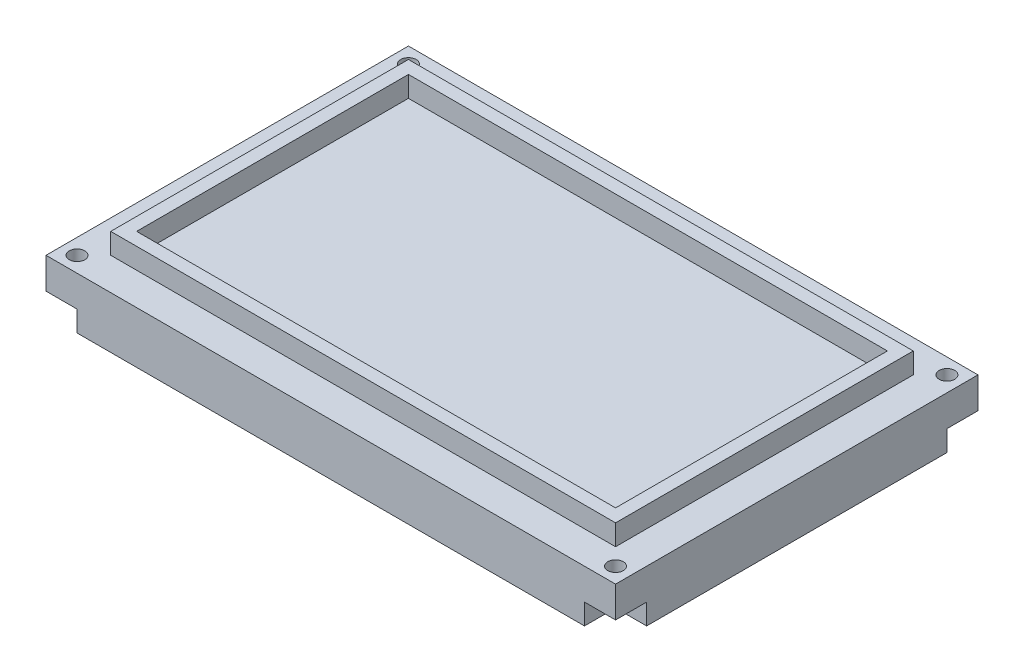
ISO-10303-21;
HEADER;
FILE_DESCRIPTION(('STEP AP214'),'2;1');
FILE_NAME('part.step','',(''),(''),'','','');
FILE_SCHEMA(('AUTOMOTIVE_DESIGN { 1 0 10303 214 1 1 1 1 }'));
ENDSEC;
DATA;
#1=APPLICATION_CONTEXT('core data for automotive mechanical design processes');
#2=APPLICATION_PROTOCOL_DEFINITION('international standard','automotive_design',2000,#1);
#3=PRODUCT_CONTEXT('',#1,'mechanical');
#4=PRODUCT('Part','Part','',(#3));
#5=PRODUCT_RELATED_PRODUCT_CATEGORY('part','',(#4));
#6=PRODUCT_DEFINITION_FORMATION('','',#4);
#7=PRODUCT_DEFINITION_CONTEXT('part definition',#1,'design');
#8=PRODUCT_DEFINITION('design','',#6,#7);
#9=PRODUCT_DEFINITION_SHAPE('','',#8);
#10=(LENGTH_UNIT() NAMED_UNIT(*) SI_UNIT(.MILLI.,.METRE.));
#11=(NAMED_UNIT(*) PLANE_ANGLE_UNIT() SI_UNIT($,.RADIAN.));
#12=(NAMED_UNIT(*) SI_UNIT($,.STERADIAN.) SOLID_ANGLE_UNIT());
#13=UNCERTAINTY_MEASURE_WITH_UNIT(LENGTH_MEASURE(1.E-05),#10,'distance_accuracy_value','');
#14=(GEOMETRIC_REPRESENTATION_CONTEXT(3) GLOBAL_UNCERTAINTY_ASSIGNED_CONTEXT((#13)) GLOBAL_UNIT_ASSIGNED_CONTEXT((#10,
#11,#12)) REPRESENTATION_CONTEXT('',''));
#15=CARTESIAN_POINT('',(0.,0.,0.));
#16=DIRECTION('',(0.,0.,1.));
#17=DIRECTION('',(1.,0.,0.));
#18=AXIS2_PLACEMENT_3D('',#15,#16,#17);
#19=CARTESIAN_POINT('',(0.,0.,0.));
#20=DIRECTION('',(0.,1.,0.));
#21=DIRECTION('',(0.,0.,1.));
#22=AXIS2_PLACEMENT_3D('',#19,#20,#21);
#23=PLANE('',#22);
#24=DIRECTION('',(1.,0.,0.));
#25=VECTOR('',#24,1.);
#26=CARTESIAN_POINT('',(-69.85,0.,-36.83));
#27=LINE('',#26,#25);
#28=CARTESIAN_POINT('',(-69.85,0.,-36.83));
#29=VERTEX_POINT('',#28);
#30=CARTESIAN_POINT('',(-62.2299999999999,0.,-36.83));
#31=VERTEX_POINT('',#30);
#32=EDGE_CURVE('E215',#29,#31,#27,.T.);
#33=ORIENTED_EDGE('',*,*,#32,.T.);
#34=DIRECTION('',(0.,0.,-1.));
#35=VECTOR('',#34,1.);
#36=CARTESIAN_POINT('',(-62.2299999999999,0.,-36.83));
#37=LINE('',#36,#35);
#38=CARTESIAN_POINT('',(-62.2299999999999,0.,-44.45));
#39=VERTEX_POINT('',#38);
#40=EDGE_CURVE('E508',#31,#39,#37,.T.);
#41=ORIENTED_EDGE('',*,*,#40,.T.);
#42=DIRECTION('',(-1.,0.,0.));
#43=VECTOR('',#42,1.);
#44=CARTESIAN_POINT('',(-69.85,0.,-44.45));
#45=LINE('',#44,#43);
#46=CARTESIAN_POINT('',(62.2299999999999,0.,-44.45));
#47=VERTEX_POINT('',#46);
#48=EDGE_CURVE('E447',#47,#39,#45,.T.);
#49=ORIENTED_EDGE('',*,*,#48,.F.);
#50=DIRECTION('',(0.,0.,-1.));
#51=VECTOR('',#50,1.);
#52=CARTESIAN_POINT('',(62.2299999999999,0.,-36.83));
#53=LINE('',#52,#51);
#54=CARTESIAN_POINT('',(62.2299999999999,0.,-36.83));
#55=VERTEX_POINT('',#54);
#56=EDGE_CURVE('E270',#55,#47,#53,.T.);
#57=ORIENTED_EDGE('',*,*,#56,.F.);
#58=DIRECTION('',(-1.,0.,0.));
#59=VECTOR('',#58,1.);
#60=CARTESIAN_POINT('',(69.85,0.,-36.83));
#61=LINE('',#60,#59);
#62=CARTESIAN_POINT('',(69.85,0.,-36.83));
#63=VERTEX_POINT('',#62);
#64=EDGE_CURVE('E481',#63,#55,#61,.T.);
#65=ORIENTED_EDGE('',*,*,#64,.F.);
#66=DIRECTION('',(0.,0.,-1.));
#67=VECTOR('',#66,1.);
#68=CARTESIAN_POINT('',(69.85,0.,-44.45));
#69=LINE('',#68,#67);
#70=CARTESIAN_POINT('',(69.85,0.,36.83));
#71=VERTEX_POINT('',#70);
#72=EDGE_CURVE('E430',#71,#63,#69,.T.);
#73=ORIENTED_EDGE('',*,*,#72,.F.);
#74=DIRECTION('',(-1.,0.,0.));
#75=VECTOR('',#74,1.);
#76=CARTESIAN_POINT('',(69.85,0.,36.83));
#77=LINE('',#76,#75);
#78=CARTESIAN_POINT('',(62.2299999999999,0.,36.83));
#79=VERTEX_POINT('',#78);
#80=EDGE_CURVE('E259',#71,#79,#77,.T.);
#81=ORIENTED_EDGE('',*,*,#80,.T.);
#82=DIRECTION('',(0.,0.,1.));
#83=VECTOR('',#82,1.);
#84=CARTESIAN_POINT('',(62.2299999999999,0.,36.83));
#85=LINE('',#84,#83);
#86=CARTESIAN_POINT('',(62.2299999999999,0.,44.45));
#87=VERTEX_POINT('',#86);
#88=EDGE_CURVE('E252',#79,#87,#85,.T.);
#89=ORIENTED_EDGE('',*,*,#88,.T.);
#90=DIRECTION('',(1.,0.,0.));
#91=VECTOR('',#90,1.);
#92=CARTESIAN_POINT('',(-69.8499999999999,0.,44.45));
#93=LINE('',#92,#91);
#94=CARTESIAN_POINT('',(-62.2299999999999,0.,44.45));
#95=VERTEX_POINT('',#94);
#96=EDGE_CURVE('E436',#95,#87,#93,.T.);
#97=ORIENTED_EDGE('',*,*,#96,.F.);
#98=DIRECTION('',(0.,0.,1.));
#99=VECTOR('',#98,1.);
#100=CARTESIAN_POINT('',(-62.2299999999999,0.,36.83));
#101=LINE('',#100,#99);
#102=CARTESIAN_POINT('',(-62.2299999999999,0.,36.83));
#103=VERTEX_POINT('',#102);
#104=EDGE_CURVE('E307',#103,#95,#101,.T.);
#105=ORIENTED_EDGE('',*,*,#104,.F.);
#106=DIRECTION('',(1.,0.,0.));
#107=VECTOR('',#106,1.);
#108=CARTESIAN_POINT('',(-69.85,0.,36.83));
#109=LINE('',#108,#107);
#110=CARTESIAN_POINT('',(-69.8499999999999,0.,36.83));
#111=VERTEX_POINT('',#110);
#112=EDGE_CURVE('E247',#111,#103,#109,.T.);
#113=ORIENTED_EDGE('',*,*,#112,.F.);
#114=DIRECTION('',(0.,0.,1.));
#115=VECTOR('',#114,1.);
#116=CARTESIAN_POINT('',(-69.85,0.,-44.45));
#117=LINE('',#116,#115);
#118=EDGE_CURVE('E450',#29,#111,#117,.T.);
#119=ORIENTED_EDGE('',*,*,#118,.F.);
#120=EDGE_LOOP('',(#33,#41,#49,#57,#65,#73,#81,#89,#97,#105,#113,#119));
#121=FACE_BOUND('',#120,.T.);
#122=ADVANCED_FACE('F39',(#121),#23,.F.);
#123=CARTESIAN_POINT('',(-69.85,12.7,-44.45));
#124=DIRECTION('',(0.,0.,1.));
#125=DIRECTION('',(1.,0.,0.));
#126=AXIS2_PLACEMENT_3D('',#123,#124,#125);
#127=PLANE('',#126);
#128=DIRECTION('',(0.,-1.,0.));
#129=VECTOR('',#128,1.);
#130=CARTESIAN_POINT('',(-62.2299999999999,5.08,-44.45));
#131=LINE('',#130,#129);
#132=CARTESIAN_POINT('',(-62.2299999999999,5.08,-44.45));
#133=VERTEX_POINT('',#132);
#134=EDGE_CURVE('E222',#133,#39,#131,.T.);
#135=ORIENTED_EDGE('',*,*,#134,.F.);
#136=DIRECTION('',(-1.,0.,0.));
#137=VECTOR('',#136,1.);
#138=CARTESIAN_POINT('',(-62.2299999999999,5.08,-44.45));
#139=LINE('',#138,#137);
#140=CARTESIAN_POINT('',(-69.8499999999999,5.08,-44.45));
#141=VERTEX_POINT('',#140);
#142=EDGE_CURVE('E209',#133,#141,#139,.T.);
#143=ORIENTED_EDGE('',*,*,#142,.T.);
#144=DIRECTION('',(0.,-1.,0.));
#145=VECTOR('',#144,1.);
#146=CARTESIAN_POINT('',(-69.85,12.7,-44.45));
#147=LINE('',#146,#145);
#148=CARTESIAN_POINT('',(-69.85,12.7,-44.45));
#149=VERTEX_POINT('',#148);
#150=EDGE_CURVE('E49',#149,#141,#147,.T.);
#151=ORIENTED_EDGE('',*,*,#150,.F.);
#152=DIRECTION('',(-1.,0.,0.));
#153=VECTOR('',#152,1.);
#154=CARTESIAN_POINT('',(-69.85,12.7,-44.45));
#155=LINE('',#154,#153);
#156=CARTESIAN_POINT('',(69.85,12.7,-44.45));
#157=VERTEX_POINT('',#156);
#158=EDGE_CURVE('E435',#157,#149,#155,.T.);
#159=ORIENTED_EDGE('',*,*,#158,.F.);
#160=DIRECTION('',(0.,-1.,0.));
#161=VECTOR('',#160,1.);
#162=CARTESIAN_POINT('',(69.85,12.7,-44.45));
#163=LINE('',#162,#161);
#164=CARTESIAN_POINT('',(69.8499999999999,5.08,-44.45));
#165=VERTEX_POINT('',#164);
#166=EDGE_CURVE('E11',#157,#165,#163,.T.);
#167=ORIENTED_EDGE('',*,*,#166,.T.);
#168=DIRECTION('',(1.,0.,0.));
#169=VECTOR('',#168,1.);
#170=CARTESIAN_POINT('',(62.2299999999999,5.08,-44.45));
#171=LINE('',#170,#169);
#172=CARTESIAN_POINT('',(62.2299999999999,5.08,-44.45));
#173=VERTEX_POINT('',#172);
#174=EDGE_CURVE('E275',#173,#165,#171,.T.);
#175=ORIENTED_EDGE('',*,*,#174,.F.);
#176=DIRECTION('',(0.,-1.,0.));
#177=VECTOR('',#176,1.);
#178=CARTESIAN_POINT('',(62.2299999999999,5.08,-44.45));
#179=LINE('',#178,#177);
#180=EDGE_CURVE('E253',#173,#47,#179,.T.);
#181=ORIENTED_EDGE('',*,*,#180,.T.);
#182=ORIENTED_EDGE('',*,*,#48,.T.);
#183=EDGE_LOOP('',(#135,#143,#151,#159,#167,#175,#181,#182));
#184=FACE_BOUND('',#183,.T.);
#185=ADVANCED_FACE('F219',(#184),#127,.F.);
#186=CARTESIAN_POINT('',(-69.85,12.7,-44.45));
#187=DIRECTION('',(1.,0.,0.));
#188=DIRECTION('',(0.,0.,-1.));
#189=AXIS2_PLACEMENT_3D('',#186,#187,#188);
#190=PLANE('',#189);
#191=DIRECTION('',(0.,-1.,0.));
#192=VECTOR('',#191,1.);
#193=CARTESIAN_POINT('',(-69.85,5.08,-36.83));
#194=LINE('',#193,#192);
#195=CARTESIAN_POINT('',(-69.85,5.08,-36.83));
#196=VERTEX_POINT('',#195);
#197=EDGE_CURVE('E57',#196,#29,#194,.T.);
#198=ORIENTED_EDGE('',*,*,#197,.T.);
#199=ORIENTED_EDGE('',*,*,#118,.T.);
#200=DIRECTION('',(0.,-1.,0.));
#201=VECTOR('',#200,1.);
#202=CARTESIAN_POINT('',(-69.85,5.08,36.83));
#203=LINE('',#202,#201);
#204=CARTESIAN_POINT('',(-69.85,5.08,36.83));
#205=VERTEX_POINT('',#204);
#206=EDGE_CURVE('E318',#205,#111,#203,.T.);
#207=ORIENTED_EDGE('',*,*,#206,.F.);
#208=DIRECTION('',(0.,0.,-1.));
#209=VECTOR('',#208,1.);
#210=CARTESIAN_POINT('',(-69.8499999999999,5.08,44.45));
#211=LINE('',#210,#209);
#212=CARTESIAN_POINT('',(-69.8499999999999,5.08,44.45));
#213=VERTEX_POINT('',#212);
#214=EDGE_CURVE('E302',#213,#205,#211,.T.);
#215=ORIENTED_EDGE('',*,*,#214,.F.);
#216=DIRECTION('',(0.,-1.,0.));
#217=VECTOR('',#216,1.);
#218=CARTESIAN_POINT('',(-69.8499999999999,12.7,44.45));
#219=LINE('',#218,#217);
#220=CARTESIAN_POINT('',(-69.8499999999999,12.7,44.45));
#221=VERTEX_POINT('',#220);
#222=EDGE_CURVE('E230',#221,#213,#219,.T.);
#223=ORIENTED_EDGE('',*,*,#222,.F.);
#224=DIRECTION('',(0.,0.,1.));
#225=VECTOR('',#224,1.);
#226=CARTESIAN_POINT('',(-69.85,12.7,-44.45));
#227=LINE('',#226,#225);
#228=EDGE_CURVE('E228',#149,#221,#227,.T.);
#229=ORIENTED_EDGE('',*,*,#228,.F.);
#230=ORIENTED_EDGE('',*,*,#150,.T.);
#231=DIRECTION('',(0.,0.,1.));
#232=VECTOR('',#231,1.);
#233=CARTESIAN_POINT('',(-69.8499999999999,5.08,-44.45));
#234=LINE('',#233,#232);
#235=EDGE_CURVE('E204',#141,#196,#234,.T.);
#236=ORIENTED_EDGE('',*,*,#235,.T.);
#237=EDGE_LOOP('',(#198,#199,#207,#215,#223,#229,#230,#236));
#238=FACE_BOUND('',#237,.T.);
#239=ADVANCED_FACE('F226',(#238),#190,.F.);
#240=CARTESIAN_POINT('',(-66.04,0.,-40.64));
#241=DIRECTION('',(0.,1.,0.));
#242=DIRECTION('',(0.,0.,1.));
#243=AXIS2_PLACEMENT_3D('',#240,#241,#242);
#244=CYLINDRICAL_SURFACE('',#243,1.90500000000001);
#245=CARTESIAN_POINT('',(-66.04,12.7,-40.64));
#246=DIRECTION('',(0.,1.,0.));
#247=DIRECTION('',(0.,0.,1.));
#248=AXIS2_PLACEMENT_3D('',#245,#246,#247);
#249=CIRCLE('',#248,1.90500000000001);
#250=CARTESIAN_POINT('',(-66.04,12.7,-38.735));
#251=VERTEX_POINT('',#250);
#252=EDGE_CURVE('E426',#251,#251,#249,.T.);
#253=ORIENTED_EDGE('',*,*,#252,.T.);
#254=EDGE_LOOP('',(#253));
#255=FACE_BOUND('',#254,.T.);
#256=CARTESIAN_POINT('',(-66.04,5.08,-40.64));
#257=DIRECTION('',(0.,-1.,0.));
#258=DIRECTION('',(0.,0.,-1.));
#259=AXIS2_PLACEMENT_3D('',#256,#257,#258);
#260=CIRCLE('',#259,1.90500000000001);
#261=CARTESIAN_POINT('',(-66.04,5.08,-42.545));
#262=VERTEX_POINT('',#261);
#263=EDGE_CURVE('E43',#262,#262,#260,.F.);
#264=ORIENTED_EDGE('',*,*,#263,.F.);
#265=EDGE_LOOP('',(#264));
#266=FACE_BOUND('',#265,.T.);
#267=ADVANCED_FACE('F558',(#255,#266),#244,.F.);
#268=CARTESIAN_POINT('',(66.04,0.,-40.64));
#269=DIRECTION('',(0.,1.,0.));
#270=DIRECTION('',(0.,0.,1.));
#271=AXIS2_PLACEMENT_3D('',#268,#269,#270);
#272=CYLINDRICAL_SURFACE('',#271,1.90500000000001);
#273=CARTESIAN_POINT('',(66.04,12.7,-40.64));
#274=DIRECTION('',(0.,-1.,0.));
#275=DIRECTION('',(0.,0.,1.));
#276=AXIS2_PLACEMENT_3D('',#273,#274,#275);
#277=CIRCLE('',#276,1.90500000000001);
#278=CARTESIAN_POINT('',(66.04,12.7,-38.735));
#279=VERTEX_POINT('',#278);
#280=EDGE_CURVE('E422',#279,#279,#277,.T.);
#281=ORIENTED_EDGE('',*,*,#280,.F.);
#282=EDGE_LOOP('',(#281));
#283=FACE_BOUND('',#282,.T.);
#284=CARTESIAN_POINT('',(66.04,5.08,-40.64));
#285=DIRECTION('',(0.,-1.,0.));
#286=DIRECTION('',(0.,0.,-1.));
#287=AXIS2_PLACEMENT_3D('',#284,#285,#286);
#288=CIRCLE('',#287,1.90500000000001);
#289=CARTESIAN_POINT('',(66.04,5.08,-42.545));
#290=VERTEX_POINT('',#289);
#291=EDGE_CURVE('E249',#290,#290,#288,.T.);
#292=ORIENTED_EDGE('',*,*,#291,.T.);
#293=EDGE_LOOP('',(#292));
#294=FACE_BOUND('',#293,.T.);
#295=ADVANCED_FACE('F562',(#283,#294),#272,.F.);
#296=CARTESIAN_POINT('',(69.85,12.7,-44.45));
#297=DIRECTION('',(-1.,0.,0.));
#298=DIRECTION('',(0.,0.,1.));
#299=AXIS2_PLACEMENT_3D('',#296,#297,#298);
#300=PLANE('',#299);
#301=ORIENTED_EDGE('',*,*,#72,.T.);
#302=DIRECTION('',(0.,-1.,0.));
#303=VECTOR('',#302,1.);
#304=CARTESIAN_POINT('',(69.85,5.08,-36.83));
#305=LINE('',#304,#303);
#306=CARTESIAN_POINT('',(69.85,5.08,-36.83));
#307=VERTEX_POINT('',#306);
#308=EDGE_CURVE('E267',#307,#63,#305,.T.);
#309=ORIENTED_EDGE('',*,*,#308,.F.);
#310=DIRECTION('',(0.,0.,1.));
#311=VECTOR('',#310,1.);
#312=CARTESIAN_POINT('',(69.8499999999999,5.08,-44.45));
#313=LINE('',#312,#311);
#314=EDGE_CURVE('E486',#165,#307,#313,.T.);
#315=ORIENTED_EDGE('',*,*,#314,.F.);
#316=ORIENTED_EDGE('',*,*,#166,.F.);
#317=DIRECTION('',(0.,0.,-1.));
#318=VECTOR('',#317,1.);
#319=CARTESIAN_POINT('',(69.85,12.7,-44.45));
#320=LINE('',#319,#318);
#321=CARTESIAN_POINT('',(69.85,12.7,44.45));
#322=VERTEX_POINT('',#321);
#323=EDGE_CURVE('E431',#322,#157,#320,.T.);
#324=ORIENTED_EDGE('',*,*,#323,.F.);
#325=DIRECTION('',(0.,-1.,0.));
#326=VECTOR('',#325,1.);
#327=CARTESIAN_POINT('',(69.85,12.7,44.45));
#328=LINE('',#327,#326);
#329=CARTESIAN_POINT('',(69.8499999999999,5.08,44.45));
#330=VERTEX_POINT('',#329);
#331=EDGE_CURVE('E234',#322,#330,#328,.T.);
#332=ORIENTED_EDGE('',*,*,#331,.T.);
#333=DIRECTION('',(0.,0.,-1.));
#334=VECTOR('',#333,1.);
#335=CARTESIAN_POINT('',(69.8499999999999,5.08,44.45));
#336=LINE('',#335,#334);
#337=CARTESIAN_POINT('',(69.85,5.08,36.83));
#338=VERTEX_POINT('',#337);
#339=EDGE_CURVE('E276',#330,#338,#336,.T.);
#340=ORIENTED_EDGE('',*,*,#339,.T.);
#341=DIRECTION('',(0.,-1.,0.));
#342=VECTOR('',#341,1.);
#343=CARTESIAN_POINT('',(69.85,5.08,36.83));
#344=LINE('',#343,#342);
#345=EDGE_CURVE('E248',#338,#71,#344,.T.);
#346=ORIENTED_EDGE('',*,*,#345,.T.);
#347=EDGE_LOOP('',(#301,#309,#315,#316,#324,#332,#340,#346));
#348=FACE_BOUND('',#347,.T.);
#349=ADVANCED_FACE('F41',(#348),#300,.F.);
#350=CARTESIAN_POINT('',(-69.8499999999999,12.7,44.45));
#351=DIRECTION('',(0.,0.,-1.));
#352=DIRECTION('',(-1.,0.,0.));
#353=AXIS2_PLACEMENT_3D('',#350,#351,#352);
#354=PLANE('',#353);
#355=DIRECTION('',(0.,-1.,0.));
#356=VECTOR('',#355,1.);
#357=CARTESIAN_POINT('',(62.2299999999999,5.08,44.45));
#358=LINE('',#357,#356);
#359=CARTESIAN_POINT('',(62.2299999999999,5.08,44.45));
#360=VERTEX_POINT('',#359);
#361=EDGE_CURVE('E289',#360,#87,#358,.T.);
#362=ORIENTED_EDGE('',*,*,#361,.F.);
#363=DIRECTION('',(1.,0.,0.));
#364=VECTOR('',#363,1.);
#365=CARTESIAN_POINT('',(62.2299999999999,5.08,44.45));
#366=LINE('',#365,#364);
#367=EDGE_CURVE('E280',#360,#330,#366,.T.);
#368=ORIENTED_EDGE('',*,*,#367,.T.);
#369=ORIENTED_EDGE('',*,*,#331,.F.);
#370=DIRECTION('',(1.,0.,0.));
#371=VECTOR('',#370,1.);
#372=CARTESIAN_POINT('',(-69.8499999999999,12.7,44.45));
#373=LINE('',#372,#371);
#374=EDGE_CURVE('E441',#221,#322,#373,.T.);
#375=ORIENTED_EDGE('',*,*,#374,.F.);
#376=ORIENTED_EDGE('',*,*,#222,.T.);
#377=DIRECTION('',(-1.,0.,0.));
#378=VECTOR('',#377,1.);
#379=CARTESIAN_POINT('',(-62.2299999999999,5.08,44.45));
#380=LINE('',#379,#378);
#381=CARTESIAN_POINT('',(-62.2299999999999,5.08,44.45));
#382=VERTEX_POINT('',#381);
#383=EDGE_CURVE('E315',#382,#213,#380,.T.);
#384=ORIENTED_EDGE('',*,*,#383,.F.);
#385=DIRECTION('',(0.,-1.,0.));
#386=VECTOR('',#385,1.);
#387=CARTESIAN_POINT('',(-62.2299999999999,5.08,44.45));
#388=LINE('',#387,#386);
#389=EDGE_CURVE('E243',#382,#95,#388,.T.);
#390=ORIENTED_EDGE('',*,*,#389,.T.);
#391=ORIENTED_EDGE('',*,*,#96,.T.);
#392=EDGE_LOOP('',(#362,#368,#369,#375,#376,#384,#390,#391));
#393=FACE_BOUND('',#392,.T.);
#394=ADVANCED_FACE('F464',(#393),#354,.F.);
#395=CARTESIAN_POINT('',(66.04,0.,40.64));
#396=DIRECTION('',(0.,1.,0.));
#397=DIRECTION('',(0.,0.,1.));
#398=AXIS2_PLACEMENT_3D('',#395,#396,#397);
#399=CYLINDRICAL_SURFACE('',#398,1.90500000000001);
#400=CARTESIAN_POINT('',(66.04,12.7,40.64));
#401=DIRECTION('',(0.,1.,0.));
#402=DIRECTION('',(0.,0.,-1.));
#403=AXIS2_PLACEMENT_3D('',#400,#401,#402);
#404=CIRCLE('',#403,1.90500000000001);
#405=CARTESIAN_POINT('',(66.04,12.7,38.735));
#406=VERTEX_POINT('',#405);
#407=EDGE_CURVE('E418',#406,#406,#404,.T.);
#408=ORIENTED_EDGE('',*,*,#407,.T.);
#409=EDGE_LOOP('',(#408));
#410=FACE_BOUND('',#409,.T.);
#411=CARTESIAN_POINT('',(66.04,5.08,40.64));
#412=DIRECTION('',(0.,-1.,0.));
#413=DIRECTION('',(0.,0.,-1.));
#414=AXIS2_PLACEMENT_3D('',#411,#412,#413);
#415=CIRCLE('',#414,1.90500000000001);
#416=CARTESIAN_POINT('',(66.04,5.08,38.735));
#417=VERTEX_POINT('',#416);
#418=EDGE_CURVE('E244',#417,#417,#415,.F.);
#419=ORIENTED_EDGE('',*,*,#418,.F.);
#420=EDGE_LOOP('',(#419));
#421=FACE_BOUND('',#420,.T.);
#422=ADVANCED_FACE('F556',(#410,#421),#399,.F.);
#423=CARTESIAN_POINT('',(-66.04,0.,40.64));
#424=DIRECTION('',(0.,1.,0.));
#425=DIRECTION('',(0.,0.,1.));
#426=AXIS2_PLACEMENT_3D('',#423,#424,#425);
#427=CYLINDRICAL_SURFACE('',#426,1.90500000000001);
#428=CARTESIAN_POINT('',(-66.04,12.7,40.64));
#429=DIRECTION('',(0.,-1.,0.));
#430=DIRECTION('',(0.,0.,-1.));
#431=AXIS2_PLACEMENT_3D('',#428,#429,#430);
#432=CIRCLE('',#431,1.90500000000001);
#433=CARTESIAN_POINT('',(-66.04,12.7,38.735));
#434=VERTEX_POINT('',#433);
#435=EDGE_CURVE('E414',#434,#434,#432,.T.);
#436=ORIENTED_EDGE('',*,*,#435,.F.);
#437=EDGE_LOOP('',(#436));
#438=FACE_BOUND('',#437,.T.);
#439=CARTESIAN_POINT('',(-66.04,5.08,40.64));
#440=DIRECTION('',(0.,-1.,0.));
#441=DIRECTION('',(0.,0.,-1.));
#442=AXIS2_PLACEMENT_3D('',#439,#440,#441);
#443=CIRCLE('',#442,1.90500000000001);
#444=CARTESIAN_POINT('',(-66.04,5.08,38.735));
#445=VERTEX_POINT('',#444);
#446=EDGE_CURVE('E238',#445,#445,#443,.T.);
#447=ORIENTED_EDGE('',*,*,#446,.T.);
#448=EDGE_LOOP('',(#447));
#449=FACE_BOUND('',#448,.T.);
#450=ADVANCED_FACE('F573',(#438,#449),#427,.F.);
#451=CARTESIAN_POINT('',(0.,12.7,0.));
#452=DIRECTION('',(0.,1.,0.));
#453=DIRECTION('',(0.,0.,1.));
#454=AXIS2_PLACEMENT_3D('',#451,#452,#453);
#455=PLANE('',#454);
#456=ORIENTED_EDGE('',*,*,#323,.T.);
#457=ORIENTED_EDGE('',*,*,#158,.T.);
#458=ORIENTED_EDGE('',*,*,#228,.T.);
#459=ORIENTED_EDGE('',*,*,#374,.T.);
#460=EDGE_LOOP('',(#456,#457,#458,#459));
#461=FACE_BOUND('',#460,.T.);
#462=ORIENTED_EDGE('',*,*,#252,.F.);
#463=EDGE_LOOP('',(#462));
#464=FACE_BOUND('',#463,.T.);
#465=ORIENTED_EDGE('',*,*,#280,.T.);
#466=EDGE_LOOP('',(#465));
#467=FACE_BOUND('',#466,.T.);
#468=ORIENTED_EDGE('',*,*,#407,.F.);
#469=EDGE_LOOP('',(#468));
#470=FACE_BOUND('',#469,.T.);
#471=ORIENTED_EDGE('',*,*,#435,.T.);
#472=EDGE_LOOP('',(#471));
#473=FACE_BOUND('',#472,.T.);
#474=DIRECTION('',(0.,0.,1.));
#475=VECTOR('',#474,1.);
#476=CARTESIAN_POINT('',(-61.9125,12.7,-36.5125));
#477=LINE('',#476,#475);
#478=CARTESIAN_POINT('',(-61.9125,12.7,-36.5125));
#479=VERTEX_POINT('',#478);
#480=CARTESIAN_POINT('',(-61.9125,12.7,36.5125));
#481=VERTEX_POINT('',#480);
#482=EDGE_CURVE('E392',#479,#481,#477,.T.);
#483=ORIENTED_EDGE('',*,*,#482,.F.);
#484=DIRECTION('',(-1.,0.,0.));
#485=VECTOR('',#484,1.);
#486=CARTESIAN_POINT('',(61.9125,12.7,-36.5125));
#487=LINE('',#486,#485);
#488=CARTESIAN_POINT('',(61.9125,12.7,-36.5125));
#489=VERTEX_POINT('',#488);
#490=EDGE_CURVE('E373',#489,#479,#487,.T.);
#491=ORIENTED_EDGE('',*,*,#490,.F.);
#492=DIRECTION('',(0.,0.,-1.));
#493=VECTOR('',#492,1.);
#494=CARTESIAN_POINT('',(61.9125,12.7,36.5125));
#495=LINE('',#494,#493);
#496=CARTESIAN_POINT('',(61.9125,12.7,36.5125));
#497=VERTEX_POINT('',#496);
#498=EDGE_CURVE('E379',#497,#489,#495,.T.);
#499=ORIENTED_EDGE('',*,*,#498,.F.);
#500=DIRECTION('',(1.,0.,0.));
#501=VECTOR('',#500,1.);
#502=CARTESIAN_POINT('',(-61.9125,12.7,36.5125));
#503=LINE('',#502,#501);
#504=EDGE_CURVE('E395',#481,#497,#503,.T.);
#505=ORIENTED_EDGE('',*,*,#504,.F.);
#506=EDGE_LOOP('',(#483,#491,#499,#505));
#507=FACE_BOUND('',#506,.T.);
#508=ADVANCED_FACE('F545',(#461,#464,#467,#470,#473,#507),#455,.T.);
#509=CARTESIAN_POINT('',(0.,17.78,0.));
#510=DIRECTION('',(0.,1.,0.));
#511=DIRECTION('',(0.,0.,1.));
#512=AXIS2_PLACEMENT_3D('',#509,#510,#511);
#513=PLANE('',#512);
#514=DIRECTION('',(-1.,0.,0.));
#515=VECTOR('',#514,1.);
#516=CARTESIAN_POINT('',(61.9125,17.78,-36.5125));
#517=LINE('',#516,#515);
#518=CARTESIAN_POINT('',(61.9125,17.78,-36.5125));
#519=VERTEX_POINT('',#518);
#520=CARTESIAN_POINT('',(-61.9125,17.78,-36.5125));
#521=VERTEX_POINT('',#520);
#522=EDGE_CURVE('E374',#519,#521,#517,.T.);
#523=ORIENTED_EDGE('',*,*,#522,.T.);
#524=DIRECTION('',(0.,0.,1.));
#525=VECTOR('',#524,1.);
#526=CARTESIAN_POINT('',(-61.9125,17.78,-36.5125));
#527=LINE('',#526,#525);
#528=CARTESIAN_POINT('',(-61.9125,17.78,36.5125));
#529=VERTEX_POINT('',#528);
#530=EDGE_CURVE('E378',#521,#529,#527,.T.);
#531=ORIENTED_EDGE('',*,*,#530,.T.);
#532=DIRECTION('',(1.,0.,0.));
#533=VECTOR('',#532,1.);
#534=CARTESIAN_POINT('',(-61.9125,17.78,36.5125));
#535=LINE('',#534,#533);
#536=CARTESIAN_POINT('',(61.9125,17.78,36.5125));
#537=VERTEX_POINT('',#536);
#538=EDGE_CURVE('E382',#529,#537,#535,.T.);
#539=ORIENTED_EDGE('',*,*,#538,.T.);
#540=DIRECTION('',(0.,0.,-1.));
#541=VECTOR('',#540,1.);
#542=CARTESIAN_POINT('',(61.9125,17.78,36.5125));
#543=LINE('',#542,#541);
#544=EDGE_CURVE('E385',#537,#519,#543,.T.);
#545=ORIENTED_EDGE('',*,*,#544,.T.);
#546=EDGE_LOOP('',(#523,#531,#539,#545));
#547=FACE_BOUND('',#546,.T.);
#548=DIRECTION('',(0.,0.,1.));
#549=VECTOR('',#548,1.);
#550=CARTESIAN_POINT('',(-58.7375,17.78,-33.3375));
#551=LINE('',#550,#549);
#552=CARTESIAN_POINT('',(-58.7375,17.78,-33.3375));
#553=VERTEX_POINT('',#552);
#554=CARTESIAN_POINT('',(-58.7375,17.78,33.3375));
#555=VERTEX_POINT('',#554);
#556=EDGE_CURVE('E336',#553,#555,#551,.T.);
#557=ORIENTED_EDGE('',*,*,#556,.F.);
#558=DIRECTION('',(-1.,0.,0.));
#559=VECTOR('',#558,1.);
#560=CARTESIAN_POINT('',(58.7375,17.78,-33.3375));
#561=LINE('',#560,#559);
#562=CARTESIAN_POINT('',(58.7375,17.78,-33.3375));
#563=VERTEX_POINT('',#562);
#564=EDGE_CURVE('E333',#563,#553,#561,.T.);
#565=ORIENTED_EDGE('',*,*,#564,.F.);
#566=DIRECTION('',(0.,0.,-1.));
#567=VECTOR('',#566,1.);
#568=CARTESIAN_POINT('',(58.7375,17.78,33.3375));
#569=LINE('',#568,#567);
#570=CARTESIAN_POINT('',(58.7375,17.78,33.3375));
#571=VERTEX_POINT('',#570);
#572=EDGE_CURVE('E344',#571,#563,#569,.T.);
#573=ORIENTED_EDGE('',*,*,#572,.F.);
#574=DIRECTION('',(1.,0.,0.));
#575=VECTOR('',#574,1.);
#576=CARTESIAN_POINT('',(-58.7375,17.78,33.3375));
#577=LINE('',#576,#575);
#578=EDGE_CURVE('E340',#555,#571,#577,.T.);
#579=ORIENTED_EDGE('',*,*,#578,.F.);
#580=EDGE_LOOP('',(#557,#565,#573,#579));
#581=FACE_BOUND('',#580,.T.);
#582=ADVANCED_FACE('F582',(#547,#581),#513,.T.);
#583=CARTESIAN_POINT('',(61.9125,17.78,-36.5125));
#584=DIRECTION('',(0.,0.,1.));
#585=DIRECTION('',(1.,0.,0.));
#586=AXIS2_PLACEMENT_3D('',#583,#584,#585);
#587=PLANE('',#586);
#588=ORIENTED_EDGE('',*,*,#490,.T.);
#589=DIRECTION('',(0.,-1.,0.));
#590=VECTOR('',#589,1.);
#591=CARTESIAN_POINT('',(-61.9125,17.78,-36.5125));
#592=LINE('',#591,#590);
#593=EDGE_CURVE('E411',#521,#479,#592,.T.);
#594=ORIENTED_EDGE('',*,*,#593,.F.);
#595=ORIENTED_EDGE('',*,*,#522,.F.);
#596=DIRECTION('',(0.,-1.,0.));
#597=VECTOR('',#596,1.);
#598=CARTESIAN_POINT('',(61.9125,17.78,-36.5125));
#599=LINE('',#598,#597);
#600=EDGE_CURVE('E388',#519,#489,#599,.T.);
#601=ORIENTED_EDGE('',*,*,#600,.T.);
#602=EDGE_LOOP('',(#588,#594,#595,#601));
#603=FACE_BOUND('',#602,.T.);
#604=ADVANCED_FACE('F578',(#603),#587,.F.);
#605=CARTESIAN_POINT('',(-61.9125,17.78,-36.5125));
#606=DIRECTION('',(1.,0.,0.));
#607=DIRECTION('',(0.,0.,-1.));
#608=AXIS2_PLACEMENT_3D('',#605,#606,#607);
#609=PLANE('',#608);
#610=ORIENTED_EDGE('',*,*,#482,.T.);
#611=DIRECTION('',(0.,-1.,0.));
#612=VECTOR('',#611,1.);
#613=CARTESIAN_POINT('',(-61.9125,17.78,36.5125));
#614=LINE('',#613,#612);
#615=EDGE_CURVE('E407',#529,#481,#614,.T.);
#616=ORIENTED_EDGE('',*,*,#615,.F.);
#617=ORIENTED_EDGE('',*,*,#530,.F.);
#618=ORIENTED_EDGE('',*,*,#593,.T.);
#619=EDGE_LOOP('',(#610,#616,#617,#618));
#620=FACE_BOUND('',#619,.T.);
#621=ADVANCED_FACE('F581',(#620),#609,.F.);
#622=CARTESIAN_POINT('',(-61.9125,17.78,36.5125));
#623=DIRECTION('',(0.,0.,-1.));
#624=DIRECTION('',(-1.,0.,0.));
#625=AXIS2_PLACEMENT_3D('',#622,#623,#624);
#626=PLANE('',#625);
#627=ORIENTED_EDGE('',*,*,#504,.T.);
#628=DIRECTION('',(0.,-1.,0.));
#629=VECTOR('',#628,1.);
#630=CARTESIAN_POINT('',(61.9125,17.78,36.5125));
#631=LINE('',#630,#629);
#632=EDGE_CURVE('E404',#537,#497,#631,.T.);
#633=ORIENTED_EDGE('',*,*,#632,.F.);
#634=ORIENTED_EDGE('',*,*,#538,.F.);
#635=ORIENTED_EDGE('',*,*,#615,.T.);
#636=EDGE_LOOP('',(#627,#633,#634,#635));
#637=FACE_BOUND('',#636,.T.);
#638=ADVANCED_FACE('F586',(#637),#626,.F.);
#639=CARTESIAN_POINT('',(61.9125,17.78,36.5125));
#640=DIRECTION('',(-1.,0.,0.));
#641=DIRECTION('',(0.,0.,1.));
#642=AXIS2_PLACEMENT_3D('',#639,#640,#641);
#643=PLANE('',#642);
#644=ORIENTED_EDGE('',*,*,#498,.T.);
#645=ORIENTED_EDGE('',*,*,#600,.F.);
#646=ORIENTED_EDGE('',*,*,#544,.F.);
#647=ORIENTED_EDGE('',*,*,#632,.T.);
#648=EDGE_LOOP('',(#644,#645,#646,#647));
#649=FACE_BOUND('',#648,.T.);
#650=ADVANCED_FACE('F590',(#649),#643,.F.);
#651=CARTESIAN_POINT('',(58.7375,17.78,-33.3375));
#652=DIRECTION('',(0.,0.,1.));
#653=DIRECTION('',(1.,0.,0.));
#654=AXIS2_PLACEMENT_3D('',#651,#652,#653);
#655=PLANE('',#654);
#656=DIRECTION('',(-1.,0.,0.));
#657=VECTOR('',#656,1.);
#658=CARTESIAN_POINT('',(58.7375,12.7,-33.3375));
#659=LINE('',#658,#657);
#660=CARTESIAN_POINT('',(58.7375,12.7,-33.3375));
#661=VERTEX_POINT('',#660);
#662=CARTESIAN_POINT('',(-58.7375,12.7,-33.3375));
#663=VERTEX_POINT('',#662);
#664=EDGE_CURVE('E242',#661,#663,#659,.T.);
#665=ORIENTED_EDGE('',*,*,#664,.F.);
#666=DIRECTION('',(0.,-1.,0.));
#667=VECTOR('',#666,1.);
#668=CARTESIAN_POINT('',(58.7375,17.78,-33.3375));
#669=LINE('',#668,#667);
#670=EDGE_CURVE('E347',#563,#661,#669,.T.);
#671=ORIENTED_EDGE('',*,*,#670,.F.);
#672=ORIENTED_EDGE('',*,*,#564,.T.);
#673=DIRECTION('',(0.,-1.,0.));
#674=VECTOR('',#673,1.);
#675=CARTESIAN_POINT('',(-58.7375,17.78,-33.3375));
#676=LINE('',#675,#674);
#677=EDGE_CURVE('E369',#553,#663,#676,.T.);
#678=ORIENTED_EDGE('',*,*,#677,.T.);
#679=EDGE_LOOP('',(#665,#671,#672,#678));
#680=FACE_BOUND('',#679,.T.);
#681=ADVANCED_FACE('F594',(#680),#655,.T.);
#682=CARTESIAN_POINT('',(-58.7375,17.78,-33.3375));
#683=DIRECTION('',(1.,0.,0.));
#684=DIRECTION('',(0.,0.,-1.));
#685=AXIS2_PLACEMENT_3D('',#682,#683,#684);
#686=PLANE('',#685);
#687=DIRECTION('',(0.,0.,1.));
#688=VECTOR('',#687,1.);
#689=CARTESIAN_POINT('',(-58.7375,12.7,-33.3375));
#690=LINE('',#689,#688);
#691=CARTESIAN_POINT('',(-58.7375,12.7,33.3375));
#692=VERTEX_POINT('',#691);
#693=EDGE_CURVE('E350',#663,#692,#690,.T.);
#694=ORIENTED_EDGE('',*,*,#693,.F.);
#695=ORIENTED_EDGE('',*,*,#677,.F.);
#696=ORIENTED_EDGE('',*,*,#556,.T.);
#697=DIRECTION('',(0.,-1.,0.));
#698=VECTOR('',#697,1.);
#699=CARTESIAN_POINT('',(-58.7375,17.78,33.3375));
#700=LINE('',#699,#698);
#701=EDGE_CURVE('E365',#555,#692,#700,.T.);
#702=ORIENTED_EDGE('',*,*,#701,.T.);
#703=EDGE_LOOP('',(#694,#695,#696,#702));
#704=FACE_BOUND('',#703,.T.);
#705=ADVANCED_FACE('F601',(#704),#686,.T.);
#706=CARTESIAN_POINT('',(-58.7375,17.78,33.3375));
#707=DIRECTION('',(0.,0.,-1.));
#708=DIRECTION('',(-1.,0.,0.));
#709=AXIS2_PLACEMENT_3D('',#706,#707,#708);
#710=PLANE('',#709);
#711=DIRECTION('',(1.,0.,0.));
#712=VECTOR('',#711,1.);
#713=CARTESIAN_POINT('',(-58.7375,12.7,33.3375));
#714=LINE('',#713,#712);
#715=CARTESIAN_POINT('',(58.7375,12.7,33.3375));
#716=VERTEX_POINT('',#715);
#717=EDGE_CURVE('E353',#692,#716,#714,.T.);
#718=ORIENTED_EDGE('',*,*,#717,.F.);
#719=ORIENTED_EDGE('',*,*,#701,.F.);
#720=ORIENTED_EDGE('',*,*,#578,.T.);
#721=DIRECTION('',(0.,-1.,0.));
#722=VECTOR('',#721,1.);
#723=CARTESIAN_POINT('',(58.7375,17.78,33.3375));
#724=LINE('',#723,#722);
#725=EDGE_CURVE('E361',#571,#716,#724,.T.);
#726=ORIENTED_EDGE('',*,*,#725,.T.);
#727=EDGE_LOOP('',(#718,#719,#720,#726));
#728=FACE_BOUND('',#727,.T.);
#729=ADVANCED_FACE('F605',(#728),#710,.T.);
#730=CARTESIAN_POINT('',(58.7375,17.78,33.3375));
#731=DIRECTION('',(-1.,0.,0.));
#732=DIRECTION('',(0.,0.,1.));
#733=AXIS2_PLACEMENT_3D('',#730,#731,#732);
#734=PLANE('',#733);
#735=DIRECTION('',(0.,0.,-1.));
#736=VECTOR('',#735,1.);
#737=CARTESIAN_POINT('',(58.7375,12.7,33.3375));
#738=LINE('',#737,#736);
#739=EDGE_CURVE('E337',#716,#661,#738,.T.);
#740=ORIENTED_EDGE('',*,*,#739,.F.);
#741=ORIENTED_EDGE('',*,*,#725,.F.);
#742=ORIENTED_EDGE('',*,*,#572,.T.);
#743=ORIENTED_EDGE('',*,*,#670,.T.);
#744=EDGE_LOOP('',(#740,#741,#742,#743));
#745=FACE_BOUND('',#744,.T.);
#746=ADVANCED_FACE('F542',(#745),#734,.T.);
#747=ORIENTED_EDGE('',*,*,#664,.T.);
#748=ORIENTED_EDGE('',*,*,#693,.T.);
#749=ORIENTED_EDGE('',*,*,#717,.T.);
#750=ORIENTED_EDGE('',*,*,#739,.T.);
#751=EDGE_LOOP('',(#747,#748,#749,#750));
#752=FACE_BOUND('',#751,.T.);
#753=ADVANCED_FACE('F535',(#752),#455,.T.);
#754=CARTESIAN_POINT('',(-62.2299999999999,5.08,36.83));
#755=DIRECTION('',(1.,0.,0.));
#756=DIRECTION('',(0.,0.,-1.));
#757=AXIS2_PLACEMENT_3D('',#754,#755,#756);
#758=PLANE('',#757);
#759=ORIENTED_EDGE('',*,*,#104,.T.);
#760=ORIENTED_EDGE('',*,*,#389,.F.);
#761=DIRECTION('',(0.,0.,1.));
#762=VECTOR('',#761,1.);
#763=CARTESIAN_POINT('',(-62.2299999999999,5.08,36.83));
#764=LINE('',#763,#762);
#765=CARTESIAN_POINT('',(-62.2299999999999,5.08,36.83));
#766=VERTEX_POINT('',#765);
#767=EDGE_CURVE('E311',#766,#382,#764,.T.);
#768=ORIENTED_EDGE('',*,*,#767,.F.);
#769=DIRECTION('',(0.,-1.,0.));
#770=VECTOR('',#769,1.);
#771=CARTESIAN_POINT('',(-62.2299999999999,5.08,36.83));
#772=LINE('',#771,#770);
#773=EDGE_CURVE('E327',#766,#103,#772,.T.);
#774=ORIENTED_EDGE('',*,*,#773,.T.);
#775=EDGE_LOOP('',(#759,#760,#768,#774));
#776=FACE_BOUND('',#775,.T.);
#777=ADVANCED_FACE('F533',(#776),#758,.F.);
#778=CARTESIAN_POINT('',(-69.85,5.08,36.83));
#779=DIRECTION('',(0.,0.,-1.));
#780=DIRECTION('',(-1.,0.,0.));
#781=AXIS2_PLACEMENT_3D('',#778,#779,#780);
#782=PLANE('',#781);
#783=ORIENTED_EDGE('',*,*,#112,.T.);
#784=ORIENTED_EDGE('',*,*,#773,.F.);
#785=DIRECTION('',(1.,0.,0.));
#786=VECTOR('',#785,1.);
#787=CARTESIAN_POINT('',(-69.85,5.08,36.83));
#788=LINE('',#787,#786);
#789=EDGE_CURVE('E306',#205,#766,#788,.T.);
#790=ORIENTED_EDGE('',*,*,#789,.F.);
#791=ORIENTED_EDGE('',*,*,#206,.T.);
#792=EDGE_LOOP('',(#783,#784,#790,#791));
#793=FACE_BOUND('',#792,.T.);
#794=ADVANCED_FACE('F526',(#793),#782,.F.);
#795=CARTESIAN_POINT('',(0.,5.08,0.));
#796=DIRECTION('',(0.,-1.,0.));
#797=DIRECTION('',(0.,0.,-1.));
#798=AXIS2_PLACEMENT_3D('',#795,#796,#797);
#799=PLANE('',#798);
#800=ORIENTED_EDGE('',*,*,#446,.F.);
#801=EDGE_LOOP('',(#800));
#802=FACE_BOUND('',#801,.T.);
#803=ORIENTED_EDGE('',*,*,#214,.T.);
#804=ORIENTED_EDGE('',*,*,#789,.T.);
#805=ORIENTED_EDGE('',*,*,#767,.T.);
#806=ORIENTED_EDGE('',*,*,#383,.T.);
#807=EDGE_LOOP('',(#803,#804,#805,#806));
#808=FACE_BOUND('',#807,.T.);
#809=ADVANCED_FACE('F531',(#802,#808),#799,.T.);
#810=CARTESIAN_POINT('',(0.,5.08,0.));
#811=DIRECTION('',(0.,-1.,0.));
#812=DIRECTION('',(0.,0.,-1.));
#813=AXIS2_PLACEMENT_3D('',#810,#811,#812);
#814=PLANE('',#813);
#815=ORIENTED_EDGE('',*,*,#339,.F.);
#816=ORIENTED_EDGE('',*,*,#367,.F.);
#817=DIRECTION('',(0.,0.,1.));
#818=VECTOR('',#817,1.);
#819=CARTESIAN_POINT('',(62.2299999999999,5.08,36.83));
#820=LINE('',#819,#818);
#821=CARTESIAN_POINT('',(62.2299999999999,5.08,36.83));
#822=VERTEX_POINT('',#821);
#823=EDGE_CURVE('E284',#822,#360,#820,.T.);
#824=ORIENTED_EDGE('',*,*,#823,.F.);
#825=DIRECTION('',(-1.,0.,0.));
#826=VECTOR('',#825,1.);
#827=CARTESIAN_POINT('',(69.85,5.08,36.83));
#828=LINE('',#827,#826);
#829=EDGE_CURVE('E287',#338,#822,#828,.T.);
#830=ORIENTED_EDGE('',*,*,#829,.F.);
#831=EDGE_LOOP('',(#815,#816,#824,#830));
#832=FACE_BOUND('',#831,.T.);
#833=ORIENTED_EDGE('',*,*,#418,.T.);
#834=EDGE_LOOP('',(#833));
#835=FACE_BOUND('',#834,.T.);
#836=ADVANCED_FACE('F468',(#832,#835),#814,.T.);
#837=CARTESIAN_POINT('',(69.85,5.08,36.83));
#838=DIRECTION('',(0.,0.,1.));
#839=DIRECTION('',(1.,0.,0.));
#840=AXIS2_PLACEMENT_3D('',#837,#838,#839);
#841=PLANE('',#840);
#842=ORIENTED_EDGE('',*,*,#80,.F.);
#843=ORIENTED_EDGE('',*,*,#345,.F.);
#844=ORIENTED_EDGE('',*,*,#829,.T.);
#845=DIRECTION('',(0.,-1.,0.));
#846=VECTOR('',#845,1.);
#847=CARTESIAN_POINT('',(62.2299999999999,5.08,36.83));
#848=LINE('',#847,#846);
#849=EDGE_CURVE('E297',#822,#79,#848,.T.);
#850=ORIENTED_EDGE('',*,*,#849,.T.);
#851=EDGE_LOOP('',(#842,#843,#844,#850));
#852=FACE_BOUND('',#851,.T.);
#853=ADVANCED_FACE('F473',(#852),#841,.T.);
#854=CARTESIAN_POINT('',(62.2299999999999,5.08,36.83));
#855=DIRECTION('',(1.,0.,0.));
#856=DIRECTION('',(0.,0.,-1.));
#857=AXIS2_PLACEMENT_3D('',#854,#855,#856);
#858=PLANE('',#857);
#859=ORIENTED_EDGE('',*,*,#88,.F.);
#860=ORIENTED_EDGE('',*,*,#849,.F.);
#861=ORIENTED_EDGE('',*,*,#823,.T.);
#862=ORIENTED_EDGE('',*,*,#361,.T.);
#863=EDGE_LOOP('',(#859,#860,#861,#862));
#864=FACE_BOUND('',#863,.T.);
#865=ADVANCED_FACE('F689',(#864),#858,.T.);
#866=CARTESIAN_POINT('',(62.2299999999999,5.08,-36.83));
#867=DIRECTION('',(-1.,0.,0.));
#868=DIRECTION('',(0.,0.,1.));
#869=AXIS2_PLACEMENT_3D('',#866,#867,#868);
#870=PLANE('',#869);
#871=ORIENTED_EDGE('',*,*,#56,.T.);
#872=ORIENTED_EDGE('',*,*,#180,.F.);
#873=DIRECTION('',(0.,0.,-1.));
#874=VECTOR('',#873,1.);
#875=CARTESIAN_POINT('',(62.2299999999999,5.08,-36.83));
#876=LINE('',#875,#874);
#877=CARTESIAN_POINT('',(62.2299999999999,5.08,-36.83));
#878=VERTEX_POINT('',#877);
#879=EDGE_CURVE('E65',#878,#173,#876,.T.);
#880=ORIENTED_EDGE('',*,*,#879,.F.);
#881=DIRECTION('',(0.,-1.,0.));
#882=VECTOR('',#881,1.);
#883=CARTESIAN_POINT('',(62.2299999999999,5.08,-36.83));
#884=LINE('',#883,#882);
#885=EDGE_CURVE('E262',#878,#55,#884,.T.);
#886=ORIENTED_EDGE('',*,*,#885,.T.);
#887=EDGE_LOOP('',(#871,#872,#880,#886));
#888=FACE_BOUND('',#887,.T.);
#889=ADVANCED_FACE('F697',(#888),#870,.F.);
#890=CARTESIAN_POINT('',(69.85,5.08,-36.83));
#891=DIRECTION('',(0.,0.,1.));
#892=DIRECTION('',(1.,0.,0.));
#893=AXIS2_PLACEMENT_3D('',#890,#891,#892);
#894=PLANE('',#893);
#895=ORIENTED_EDGE('',*,*,#64,.T.);
#896=ORIENTED_EDGE('',*,*,#885,.F.);
#897=DIRECTION('',(-1.,0.,0.));
#898=VECTOR('',#897,1.);
#899=CARTESIAN_POINT('',(69.85,5.08,-36.83));
#900=LINE('',#899,#898);
#901=EDGE_CURVE('E493',#307,#878,#900,.T.);
#902=ORIENTED_EDGE('',*,*,#901,.F.);
#903=ORIENTED_EDGE('',*,*,#308,.T.);
#904=EDGE_LOOP('',(#895,#896,#902,#903));
#905=FACE_BOUND('',#904,.T.);
#906=ADVANCED_FACE('F737',(#905),#894,.F.);
#907=CARTESIAN_POINT('',(0.,5.08,0.));
#908=DIRECTION('',(0.,-1.,0.));
#909=DIRECTION('',(0.,0.,1.));
#910=AXIS2_PLACEMENT_3D('',#907,#908,#909);
#911=PLANE('',#910);
#912=ORIENTED_EDGE('',*,*,#291,.F.);
#913=EDGE_LOOP('',(#912));
#914=FACE_BOUND('',#913,.T.);
#915=ORIENTED_EDGE('',*,*,#314,.T.);
#916=ORIENTED_EDGE('',*,*,#901,.T.);
#917=ORIENTED_EDGE('',*,*,#879,.T.);
#918=ORIENTED_EDGE('',*,*,#174,.T.);
#919=EDGE_LOOP('',(#915,#916,#917,#918));
#920=FACE_BOUND('',#919,.T.);
#921=ADVANCED_FACE('F747',(#914,#920),#911,.T.);
#922=CARTESIAN_POINT('',(0.,5.08,0.));
#923=DIRECTION('',(0.,-1.,0.));
#924=DIRECTION('',(0.,0.,1.));
#925=AXIS2_PLACEMENT_3D('',#922,#923,#924);
#926=PLANE('',#925);
#927=ORIENTED_EDGE('',*,*,#235,.F.);
#928=ORIENTED_EDGE('',*,*,#142,.F.);
#929=DIRECTION('',(0.,0.,-1.));
#930=VECTOR('',#929,1.);
#931=CARTESIAN_POINT('',(-62.2299999999999,5.08,-36.83));
#932=LINE('',#931,#930);
#933=CARTESIAN_POINT('',(-62.2299999999999,5.08,-36.83));
#934=VERTEX_POINT('',#933);
#935=EDGE_CURVE('E224',#934,#133,#932,.T.);
#936=ORIENTED_EDGE('',*,*,#935,.F.);
#937=DIRECTION('',(1.,0.,0.));
#938=VECTOR('',#937,1.);
#939=CARTESIAN_POINT('',(-69.85,5.08,-36.83));
#940=LINE('',#939,#938);
#941=EDGE_CURVE('E211',#196,#934,#940,.T.);
#942=ORIENTED_EDGE('',*,*,#941,.F.);
#943=EDGE_LOOP('',(#927,#928,#936,#942));
#944=FACE_BOUND('',#943,.T.);
#945=ORIENTED_EDGE('',*,*,#263,.T.);
#946=EDGE_LOOP('',(#945));
#947=FACE_BOUND('',#946,.T.);
#948=ADVANCED_FACE('F206',(#944,#947),#926,.T.);
#949=CARTESIAN_POINT('',(-69.85,5.08,-36.83));
#950=DIRECTION('',(0.,0.,-1.));
#951=DIRECTION('',(-1.,0.,0.));
#952=AXIS2_PLACEMENT_3D('',#949,#950,#951);
#953=PLANE('',#952);
#954=ORIENTED_EDGE('',*,*,#32,.F.);
#955=ORIENTED_EDGE('',*,*,#197,.F.);
#956=ORIENTED_EDGE('',*,*,#941,.T.);
#957=DIRECTION('',(0.,-1.,0.));
#958=VECTOR('',#957,1.);
#959=CARTESIAN_POINT('',(-62.2299999999999,5.08,-36.83));
#960=LINE('',#959,#958);
#961=EDGE_CURVE('E501',#934,#31,#960,.T.);
#962=ORIENTED_EDGE('',*,*,#961,.T.);
#963=EDGE_LOOP('',(#954,#955,#956,#962));
#964=FACE_BOUND('',#963,.T.);
#965=ADVANCED_FACE('F519',(#964),#953,.T.);
#966=CARTESIAN_POINT('',(-62.2299999999999,5.08,-36.83));
#967=DIRECTION('',(-1.,0.,0.));
#968=DIRECTION('',(0.,0.,1.));
#969=AXIS2_PLACEMENT_3D('',#966,#967,#968);
#970=PLANE('',#969);
#971=ORIENTED_EDGE('',*,*,#40,.F.);
#972=ORIENTED_EDGE('',*,*,#961,.F.);
#973=ORIENTED_EDGE('',*,*,#935,.T.);
#974=ORIENTED_EDGE('',*,*,#134,.T.);
#975=EDGE_LOOP('',(#971,#972,#973,#974));
#976=FACE_BOUND('',#975,.T.);
#977=ADVANCED_FACE('F518',(#976),#970,.T.);
#978=CLOSED_SHELL('',(#122,#185,#239,#267,#295,#349,#394,#422,#450,#508,#582,#604,#621,#638,
#650,#681,#705,#729,#746,#753,#777,#794,#809,#836,#853,#865,#889,#906,#921,#948,#965,#977));
#979=MANIFOLD_SOLID_BREP('B2',#978);
#980=ADVANCED_BREP_SHAPE_REPRESENTATION('',(#18,#979),#14);
#981=SHAPE_DEFINITION_REPRESENTATION(#9,#980);
ENDSEC;
END-ISO-10303-21;
